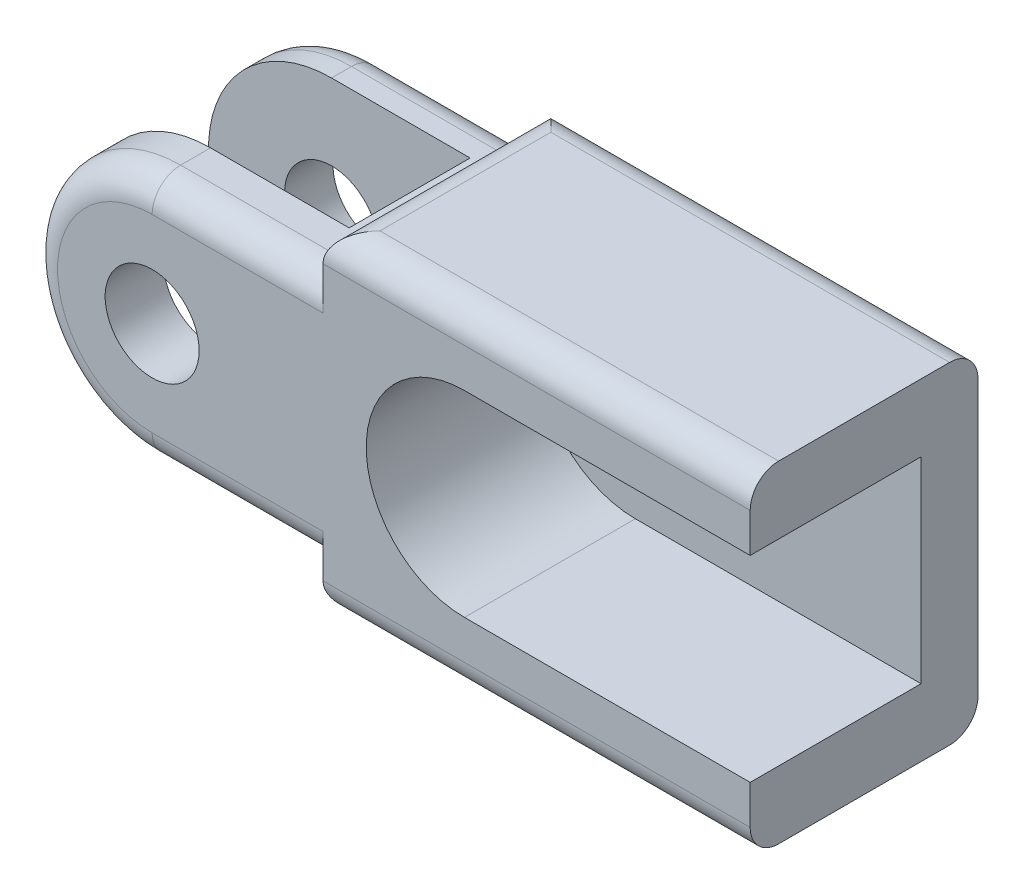
ISO-10303-21;
HEADER;
FILE_DESCRIPTION(('STEP AP214'),'2;1');
FILE_NAME('part.step','',(''),(''),'','','');
FILE_SCHEMA(('AUTOMOTIVE_DESIGN { 1 0 10303 214 1 1 1 1 }'));
ENDSEC;
DATA;
#1=APPLICATION_CONTEXT('core data for automotive mechanical design processes');
#2=APPLICATION_PROTOCOL_DEFINITION('international standard','automotive_design',2000,#1);
#3=PRODUCT_CONTEXT('',#1,'mechanical');
#4=PRODUCT('Part','Part','',(#3));
#5=PRODUCT_RELATED_PRODUCT_CATEGORY('part','',(#4));
#6=PRODUCT_DEFINITION_FORMATION('','',#4);
#7=PRODUCT_DEFINITION_CONTEXT('part definition',#1,'design');
#8=PRODUCT_DEFINITION('design','',#6,#7);
#9=PRODUCT_DEFINITION_SHAPE('','',#8);
#10=(LENGTH_UNIT() NAMED_UNIT(*) SI_UNIT(.MILLI.,.METRE.));
#11=(NAMED_UNIT(*) PLANE_ANGLE_UNIT() SI_UNIT($,.RADIAN.));
#12=(NAMED_UNIT(*) SI_UNIT($,.STERADIAN.) SOLID_ANGLE_UNIT());
#13=UNCERTAINTY_MEASURE_WITH_UNIT(LENGTH_MEASURE(1.E-05),#10,'distance_accuracy_value','');
#14=(GEOMETRIC_REPRESENTATION_CONTEXT(3) GLOBAL_UNCERTAINTY_ASSIGNED_CONTEXT((#13)) GLOBAL_UNIT_ASSIGNED_CONTEXT((#10,
#11,#12)) REPRESENTATION_CONTEXT('',''));
#15=CARTESIAN_POINT('',(0.,0.,0.));
#16=DIRECTION('',(0.,0.,1.));
#17=DIRECTION('',(1.,0.,0.));
#18=AXIS2_PLACEMENT_3D('',#15,#16,#17);
#19=CARTESIAN_POINT('',(-1.,0.,10.));
#20=DIRECTION('',(0.,0.,-1.));
#21=DIRECTION('',(-1.,0.,0.));
#22=AXIS2_PLACEMENT_3D('',#19,#20,#21);
#23=CYLINDRICAL_SURFACE('',#22,4.32034779176756);
#24=DIRECTION('',(0.,0.,-1.));
#25=VECTOR('',#24,1.);
#26=CARTESIAN_POINT('',(-1.,4.32034779176756,10.));
#27=LINE('',#26,#25);
#28=CARTESIAN_POINT('',(-1.,4.32034779176756,3.7));
#29=VERTEX_POINT('',#28);
#30=CARTESIAN_POINT('',(-1.,4.32034779176756,3.));
#31=VERTEX_POINT('',#30);
#32=EDGE_CURVE('E329',#29,#31,#27,.T.);
#33=ORIENTED_EDGE('',*,*,#32,.T.);
#34=CARTESIAN_POINT('',(-1.,0.,3.));
#35=DIRECTION('',(0.,0.,1.));
#36=DIRECTION('',(1.,0.,0.));
#37=AXIS2_PLACEMENT_3D('',#34,#35,#36);
#38=CIRCLE('',#37,4.32034779176756);
#39=CARTESIAN_POINT('',(-1.,-4.32034779176756,3.));
#40=VERTEX_POINT('',#39);
#41=EDGE_CURVE('E452',#31,#40,#38,.T.);
#42=ORIENTED_EDGE('',*,*,#41,.T.);
#43=DIRECTION('',(0.,0.,-1.));
#44=VECTOR('',#43,1.);
#45=CARTESIAN_POINT('',(-1.,-4.32034779176756,10.));
#46=LINE('',#45,#44);
#47=CARTESIAN_POINT('',(-1.,-4.32034779176756,3.7));
#48=VERTEX_POINT('',#47);
#49=EDGE_CURVE('E326',#48,#40,#46,.T.);
#50=ORIENTED_EDGE('',*,*,#49,.F.);
#51=CARTESIAN_POINT('',(-1.,0.,3.7));
#52=DIRECTION('',(0.,0.,-1.));
#53=DIRECTION('',(-1.,0.,0.));
#54=AXIS2_PLACEMENT_3D('',#51,#52,#53);
#55=CIRCLE('',#54,4.32034779176756);
#56=EDGE_CURVE('E295',#48,#29,#55,.T.);
#57=ORIENTED_EDGE('',*,*,#56,.T.);
#58=EDGE_LOOP('',(#33,#42,#50,#57));
#59=FACE_BOUND('',#58,.T.);
#60=ADVANCED_FACE('F58',(#59),#23,.T.);
#61=CARTESIAN_POINT('',(0.,-4.32034779176756,10.));
#62=DIRECTION('',(0.,-1.,0.));
#63=DIRECTION('',(0.,0.,-1.));
#64=AXIS2_PLACEMENT_3D('',#61,#62,#63);
#65=PLANE('',#64);
#66=ORIENTED_EDGE('',*,*,#49,.T.);
#67=DIRECTION('',(-1.,0.,0.));
#68=VECTOR('',#67,1.);
#69=CARTESIAN_POINT('',(0.,-4.32034779176756,3.));
#70=LINE('',#69,#68);
#71=CARTESIAN_POINT('',(0.,-4.32034779176756,3.));
#72=VERTEX_POINT('',#71);
#73=EDGE_CURVE('E405',#40,#72,#70,.F.);
#74=ORIENTED_EDGE('',*,*,#73,.T.);
#75=DIRECTION('',(0.,0.,-1.));
#76=VECTOR('',#75,1.);
#77=CARTESIAN_POINT('',(0.,-4.32034779176756,10.));
#78=LINE('',#77,#76);
#79=CARTESIAN_POINT('',(0.,-4.32034779176756,3.7));
#80=VERTEX_POINT('',#79);
#81=EDGE_CURVE('E323',#80,#72,#78,.T.);
#82=ORIENTED_EDGE('',*,*,#81,.F.);
#83=DIRECTION('',(1.,0.,0.));
#84=VECTOR('',#83,1.);
#85=CARTESIAN_POINT('',(0.,-4.32034779176756,3.7));
#86=LINE('',#85,#84);
#87=EDGE_CURVE('E293',#48,#80,#86,.T.);
#88=ORIENTED_EDGE('',*,*,#87,.F.);
#89=EDGE_LOOP('',(#66,#74,#82,#88));
#90=FACE_BOUND('',#89,.T.);
#91=ADVANCED_FACE('F556',(#90),#65,.T.);
#92=CARTESIAN_POINT('',(0.,0.,10.));
#93=DIRECTION('',(1.,0.,0.));
#94=DIRECTION('',(0.,0.,-1.));
#95=AXIS2_PLACEMENT_3D('',#92,#93,#94);
#96=PLANE('',#95);
#97=ORIENTED_EDGE('',*,*,#81,.T.);
#98=CARTESIAN_POINT('',(0.,-3.32034779176756,3.));
#99=DIRECTION('',(1.,0.,0.));
#100=DIRECTION('',(0.,0.,-1.));
#101=AXIS2_PLACEMENT_3D('',#98,#99,#100);
#102=CIRCLE('',#101,1.);
#103=CARTESIAN_POINT('',(0.,-4.31965220823244,2.96270813448246));
#104=VERTEX_POINT('',#103);
#105=EDGE_CURVE('E407',#72,#104,#102,.T.);
#106=ORIENTED_EDGE('',*,*,#105,.T.);
#107=DIRECTION('',(0.,0.,-1.));
#108=VECTOR('',#107,1.);
#109=CARTESIAN_POINT('',(0.,-4.31965220823244,10.));
#110=LINE('',#109,#108);
#111=CARTESIAN_POINT('',(0.,-4.31965220823244,3.7));
#112=VERTEX_POINT('',#111);
#113=EDGE_CURVE('E306',#112,#104,#110,.T.);
#114=ORIENTED_EDGE('',*,*,#113,.F.);
#115=DIRECTION('',(0.,1.,0.));
#116=VECTOR('',#115,1.);
#117=CARTESIAN_POINT('',(0.,0.,3.7));
#118=LINE('',#117,#116);
#119=EDGE_CURVE('E291',#80,#112,#118,.T.);
#120=ORIENTED_EDGE('',*,*,#119,.F.);
#121=EDGE_LOOP('',(#97,#106,#114,#120));
#122=FACE_BOUND('',#121,.T.);
#123=ADVANCED_FACE('F563',(#122),#96,.T.);
#124=CARTESIAN_POINT('',(-1.,0.,2.));
#125=DIRECTION('',(0.,0.,1.));
#126=DIRECTION('',(1.,0.,0.));
#127=AXIS2_PLACEMENT_3D('',#124,#125,#126);
#128=CYLINDRICAL_SURFACE('',#127,1.65);
#129=CARTESIAN_POINT('',(-1.,0.,3.7));
#130=DIRECTION('',(0.,0.,-1.));
#131=DIRECTION('',(-1.,0.,0.));
#132=AXIS2_PLACEMENT_3D('',#129,#130,#131);
#133=CIRCLE('',#132,1.65);
#134=CARTESIAN_POINT('',(-2.65,0.,3.7));
#135=VERTEX_POINT('',#134);
#136=EDGE_CURVE('E290',#135,#135,#133,.F.);
#137=ORIENTED_EDGE('',*,*,#136,.T.);
#138=EDGE_LOOP('',(#137));
#139=FACE_BOUND('',#138,.T.);
#140=CARTESIAN_POINT('',(-1.,0.,2.));
#141=DIRECTION('',(0.,0.,1.));
#142=DIRECTION('',(1.,0.,0.));
#143=AXIS2_PLACEMENT_3D('',#140,#141,#142);
#144=CIRCLE('',#143,1.65);
#145=CARTESIAN_POINT('',(0.65,0.,2.));
#146=VERTEX_POINT('',#145);
#147=EDGE_CURVE('E303',#146,#146,#144,.T.);
#148=ORIENTED_EDGE('',*,*,#147,.F.);
#149=EDGE_LOOP('',(#148));
#150=FACE_BOUND('',#149,.T.);
#151=ADVANCED_FACE('F613',(#139,#150),#128,.F.);
#152=CARTESIAN_POINT('',(5.,0.,0.));
#153=DIRECTION('',(-1.,0.,0.));
#154=DIRECTION('',(0.,-1.,0.));
#155=AXIS2_PLACEMENT_3D('',#152,#153,#154);
#156=PLANE('',#155);
#157=DIRECTION('',(0.,-1.,0.));
#158=VECTOR('',#157,1.);
#159=CARTESIAN_POINT('',(5.,0.,2.));
#160=LINE('',#159,#158);
#161=CARTESIAN_POINT('',(5.,-3.32034779176756,2.));
#162=VERTEX_POINT('',#161);
#163=CARTESIAN_POINT('',(5.,-4.82034779176756,2.));
#164=VERTEX_POINT('',#163);
#165=EDGE_CURVE('E335',#162,#164,#160,.T.);
#166=ORIENTED_EDGE('',*,*,#165,.T.);
#167=DIRECTION('',(0.,0.,1.));
#168=VECTOR('',#167,1.);
#169=CARTESIAN_POINT('',(5.,-4.82034779176756,0.));
#170=LINE('',#169,#168);
#171=CARTESIAN_POINT('',(5.,-4.82034779176756,10.));
#172=VERTEX_POINT('',#171);
#173=EDGE_CURVE('E428',#164,#172,#170,.T.);
#174=ORIENTED_EDGE('',*,*,#173,.T.);
#175=DIRECTION('',(0.,1.,0.));
#176=VECTOR('',#175,1.);
#177=CARTESIAN_POINT('',(5.,0.,10.));
#178=LINE('',#177,#176);
#179=CARTESIAN_POINT('',(5.,-3.32034779176756,10.));
#180=VERTEX_POINT('',#179);
#181=EDGE_CURVE('E333',#172,#180,#178,.T.);
#182=ORIENTED_EDGE('',*,*,#181,.T.);
#183=CARTESIAN_POINT('',(5.,-3.32034779176756,9.));
#184=DIRECTION('',(-1.,0.,0.));
#185=DIRECTION('',(0.,-1.,0.));
#186=AXIS2_PLACEMENT_3D('',#183,#184,#185);
#187=CIRCLE('',#186,1.);
#188=CARTESIAN_POINT('',(5.,-4.31965220823244,9.03729186551754));
#189=VERTEX_POINT('',#188);
#190=EDGE_CURVE('E12',#180,#189,#187,.F.);
#191=ORIENTED_EDGE('',*,*,#190,.T.);
#192=DIRECTION('',(0.,0.,-1.));
#193=VECTOR('',#192,1.);
#194=CARTESIAN_POINT('',(5.,-4.31965220823244,10.));
#195=LINE('',#194,#193);
#196=CARTESIAN_POINT('',(5.,-4.31965220823244,2.96270813448246));
#197=VERTEX_POINT('',#196);
#198=EDGE_CURVE('E309',#189,#197,#195,.T.);
#199=ORIENTED_EDGE('',*,*,#198,.T.);
#200=CARTESIAN_POINT('',(5.,-3.32034779176756,3.));
#201=DIRECTION('',(-1.,0.,0.));
#202=DIRECTION('',(0.,-1.,0.));
#203=AXIS2_PLACEMENT_3D('',#200,#201,#202);
#204=CIRCLE('',#203,1.);
#205=EDGE_CURVE('E458',#197,#162,#204,.F.);
#206=ORIENTED_EDGE('',*,*,#205,.T.);
#207=EDGE_LOOP('',(#166,#174,#182,#191,#199,#206));
#208=FACE_BOUND('',#207,.T.);
#209=ADVANCED_FACE('F499',(#208),#156,.T.);
#210=CARTESIAN_POINT('',(5.,3.32034779176756,10.));
#211=VERTEX_POINT('',#210);
#212=CARTESIAN_POINT('',(5.,4.82034779176756,10.));
#213=VERTEX_POINT('',#212);
#214=EDGE_CURVE('E332',#211,#213,#178,.T.);
#215=ORIENTED_EDGE('',*,*,#214,.T.);
#216=DIRECTION('',(0.,0.,1.));
#217=VECTOR('',#216,1.);
#218=CARTESIAN_POINT('',(5.,4.82034779176756,0.));
#219=LINE('',#218,#217);
#220=CARTESIAN_POINT('',(5.,4.82034779176756,2.));
#221=VERTEX_POINT('',#220);
#222=EDGE_CURVE('E442',#213,#221,#219,.F.);
#223=ORIENTED_EDGE('',*,*,#222,.T.);
#224=CARTESIAN_POINT('',(5.,3.32034779176756,2.));
#225=VERTEX_POINT('',#224);
#226=EDGE_CURVE('E336',#221,#225,#160,.T.);
#227=ORIENTED_EDGE('',*,*,#226,.T.);
#228=CARTESIAN_POINT('',(5.,3.32034779176756,3.));
#229=DIRECTION('',(-1.,0.,0.));
#230=DIRECTION('',(0.,-1.,0.));
#231=AXIS2_PLACEMENT_3D('',#228,#229,#230);
#232=CIRCLE('',#231,1.);
#233=CARTESIAN_POINT('',(5.,4.32034779176756,3.));
#234=VERTEX_POINT('',#233);
#235=EDGE_CURVE('E456',#225,#234,#232,.F.);
#236=ORIENTED_EDGE('',*,*,#235,.T.);
#237=DIRECTION('',(0.,0.,1.));
#238=VECTOR('',#237,1.);
#239=CARTESIAN_POINT('',(5.,4.32034779176756,10.));
#240=LINE('',#239,#238);
#241=CARTESIAN_POINT('',(5.,4.32034779176756,9.));
#242=VERTEX_POINT('',#241);
#243=EDGE_CURVE('E312',#234,#242,#240,.T.);
#244=ORIENTED_EDGE('',*,*,#243,.T.);
#245=CARTESIAN_POINT('',(5.,3.32034779176756,9.));
#246=DIRECTION('',(-1.,0.,0.));
#247=DIRECTION('',(0.,-1.,0.));
#248=AXIS2_PLACEMENT_3D('',#245,#246,#247);
#249=CIRCLE('',#248,1.);
#250=EDGE_CURVE('E67',#242,#211,#249,.F.);
#251=ORIENTED_EDGE('',*,*,#250,.T.);
#252=EDGE_LOOP('',(#215,#223,#227,#236,#244,#251));
#253=FACE_BOUND('',#252,.T.);
#254=ADVANCED_FACE('F522',(#253),#156,.T.);
#255=CARTESIAN_POINT('',(0.,0.,10.));
#256=DIRECTION('',(0.,0.,1.));
#257=DIRECTION('',(1.,0.,0.));
#258=AXIS2_PLACEMENT_3D('',#255,#256,#257);
#259=PLANE('',#258);
#260=CARTESIAN_POINT('',(-1.,0.,10.));
#261=DIRECTION('',(0.,0.,1.));
#262=DIRECTION('',(1.,0.,0.));
#263=AXIS2_PLACEMENT_3D('',#260,#261,#262);
#264=CIRCLE('',#263,1.65);
#265=CARTESIAN_POINT('',(0.65,0.,10.));
#266=VERTEX_POINT('',#265);
#267=EDGE_CURVE('E302',#266,#266,#264,.T.);
#268=ORIENTED_EDGE('',*,*,#267,.F.);
#269=EDGE_LOOP('',(#268));
#270=FACE_BOUND('',#269,.T.);
#271=DIRECTION('',(0.,1.,0.));
#272=VECTOR('',#271,1.);
#273=CARTESIAN_POINT('',(20.,6.,10.));
#274=LINE('',#273,#272);
#275=CARTESIAN_POINT('',(20.,3.45,10.));
#276=VERTEX_POINT('',#275);
#277=CARTESIAN_POINT('',(20.,4.82034779176756,10.));
#278=VERTEX_POINT('',#277);
#279=EDGE_CURVE('E375',#276,#278,#274,.T.);
#280=ORIENTED_EDGE('',*,*,#279,.T.);
#281=DIRECTION('',(-1.,0.,0.));
#282=VECTOR('',#281,1.);
#283=CARTESIAN_POINT('',(0.,4.82034779176756,10.));
#284=LINE('',#283,#282);
#285=EDGE_CURVE('E422',#278,#213,#284,.T.);
#286=ORIENTED_EDGE('',*,*,#285,.T.);
#287=ORIENTED_EDGE('',*,*,#214,.F.);
#288=DIRECTION('',(1.,0.,0.));
#289=VECTOR('',#288,1.);
#290=CARTESIAN_POINT('',(0.,3.32034779176756,10.));
#291=LINE('',#290,#289);
#292=CARTESIAN_POINT('',(-1.,3.32034779176756,10.));
#293=VERTEX_POINT('',#292);
#294=EDGE_CURVE('E418',#211,#293,#291,.F.);
#295=ORIENTED_EDGE('',*,*,#294,.T.);
#296=CARTESIAN_POINT('',(-1.,0.,10.));
#297=DIRECTION('',(0.,0.,1.));
#298=DIRECTION('',(1.,0.,0.));
#299=AXIS2_PLACEMENT_3D('',#296,#297,#298);
#300=CIRCLE('',#299,3.32034779176756);
#301=CARTESIAN_POINT('',(-1.,-3.32034779176756,10.));
#302=VERTEX_POINT('',#301);
#303=EDGE_CURVE('E413',#293,#302,#300,.T.);
#304=ORIENTED_EDGE('',*,*,#303,.T.);
#305=DIRECTION('',(-1.,0.,0.));
#306=VECTOR('',#305,1.);
#307=CARTESIAN_POINT('',(0.,-3.32034779176756,10.));
#308=LINE('',#307,#306);
#309=EDGE_CURVE('E415',#302,#180,#308,.F.);
#310=ORIENTED_EDGE('',*,*,#309,.T.);
#311=ORIENTED_EDGE('',*,*,#181,.F.);
#312=DIRECTION('',(1.,0.,0.));
#313=VECTOR('',#312,1.);
#314=CARTESIAN_POINT('',(0.,-4.82034779176756,10.));
#315=LINE('',#314,#313);
#316=CARTESIAN_POINT('',(20.,-4.82034779176756,10.));
#317=VERTEX_POINT('',#316);
#318=EDGE_CURVE('E420',#172,#317,#315,.T.);
#319=ORIENTED_EDGE('',*,*,#318,.T.);
#320=CARTESIAN_POINT('',(20.,-3.45,10.));
#321=VERTEX_POINT('',#320);
#322=EDGE_CURVE('E376',#317,#321,#274,.T.);
#323=ORIENTED_EDGE('',*,*,#322,.T.);
#324=DIRECTION('',(1.,0.,0.));
#325=VECTOR('',#324,1.);
#326=CARTESIAN_POINT('',(9.96761183830891,-3.45,10.));
#327=LINE('',#326,#325);
#328=CARTESIAN_POINT('',(9.96761183830891,-3.45,10.));
#329=VERTEX_POINT('',#328);
#330=EDGE_CURVE('E355',#329,#321,#327,.T.);
#331=ORIENTED_EDGE('',*,*,#330,.F.);
#332=CARTESIAN_POINT('',(9.96761183830891,0.,10.));
#333=DIRECTION('',(0.,0.,1.));
#334=DIRECTION('',(1.,0.,0.));
#335=AXIS2_PLACEMENT_3D('',#332,#333,#334);
#336=CIRCLE('',#335,3.45);
#337=CARTESIAN_POINT('',(9.96761183830891,3.45,10.));
#338=VERTEX_POINT('',#337);
#339=EDGE_CURVE('E349',#338,#329,#336,.T.);
#340=ORIENTED_EDGE('',*,*,#339,.F.);
#341=DIRECTION('',(-1.,0.,0.));
#342=VECTOR('',#341,1.);
#343=CARTESIAN_POINT('',(0.,3.45,10.));
#344=LINE('',#343,#342);
#345=EDGE_CURVE('E378',#276,#338,#344,.T.);
#346=ORIENTED_EDGE('',*,*,#345,.F.);
#347=EDGE_LOOP('',(#280,#286,#287,#295,#304,#310,#311,#319,#323,#331,#340,#346));
#348=FACE_BOUND('',#347,.T.);
#349=ADVANCED_FACE('F531',(#270,#348),#259,.T.);
#350=CARTESIAN_POINT('',(0.,0.,2.));
#351=DIRECTION('',(0.,0.,1.));
#352=DIRECTION('',(1.,0.,0.));
#353=AXIS2_PLACEMENT_3D('',#350,#351,#352);
#354=PLANE('',#353);
#355=ORIENTED_EDGE('',*,*,#147,.T.);
#356=EDGE_LOOP('',(#355));
#357=FACE_BOUND('',#356,.T.);
#358=CARTESIAN_POINT('',(13.9676118383089,0.,2.));
#359=DIRECTION('',(0.,0.,1.));
#360=DIRECTION('',(1.,0.,0.));
#361=AXIS2_PLACEMENT_3D('',#358,#359,#360);
#362=CIRCLE('',#361,1.35);
#363=CARTESIAN_POINT('',(15.3176118383089,0.,2.));
#364=VERTEX_POINT('',#363);
#365=EDGE_CURVE('E341',#364,#364,#362,.F.);
#366=ORIENTED_EDGE('',*,*,#365,.F.);
#367=EDGE_LOOP('',(#366));
#368=FACE_BOUND('',#367,.T.);
#369=CARTESIAN_POINT('',(9.96761183830889,0.,2.));
#370=DIRECTION('',(0.,0.,1.));
#371=DIRECTION('',(1.,0.,0.));
#372=AXIS2_PLACEMENT_3D('',#369,#370,#371);
#373=CIRCLE('',#372,1.35);
#374=CARTESIAN_POINT('',(11.3176118383089,0.,2.));
#375=VERTEX_POINT('',#374);
#376=EDGE_CURVE('E342',#375,#375,#373,.F.);
#377=ORIENTED_EDGE('',*,*,#376,.F.);
#378=EDGE_LOOP('',(#377));
#379=FACE_BOUND('',#378,.T.);
#380=ORIENTED_EDGE('',*,*,#226,.F.);
#381=DIRECTION('',(-1.,0.,0.));
#382=VECTOR('',#381,1.);
#383=CARTESIAN_POINT('',(20.,4.82034779176756,2.));
#384=LINE('',#383,#382);
#385=CARTESIAN_POINT('',(20.,4.82034779176756,2.));
#386=VERTEX_POINT('',#385);
#387=EDGE_CURVE('E398',#221,#386,#384,.F.);
#388=ORIENTED_EDGE('',*,*,#387,.T.);
#389=DIRECTION('',(0.,-1.,0.));
#390=VECTOR('',#389,1.);
#391=CARTESIAN_POINT('',(20.,6.,2.));
#392=LINE('',#391,#390);
#393=CARTESIAN_POINT('',(20.,-4.82034779176756,2.));
#394=VERTEX_POINT('',#393);
#395=EDGE_CURVE('E338',#386,#394,#392,.T.);
#396=ORIENTED_EDGE('',*,*,#395,.T.);
#397=DIRECTION('',(1.,0.,0.));
#398=VECTOR('',#397,1.);
#399=CARTESIAN_POINT('',(5.,-4.82034779176756,2.));
#400=LINE('',#399,#398);
#401=EDGE_CURVE('E396',#394,#164,#400,.F.);
#402=ORIENTED_EDGE('',*,*,#401,.T.);
#403=ORIENTED_EDGE('',*,*,#165,.F.);
#404=DIRECTION('',(-1.,0.,0.));
#405=VECTOR('',#404,1.);
#406=CARTESIAN_POINT('',(-1.,-3.32034779176756,2.));
#407=LINE('',#406,#405);
#408=CARTESIAN_POINT('',(-1.,-3.32034779176756,2.));
#409=VERTEX_POINT('',#408);
#410=EDGE_CURVE('E391',#162,#409,#407,.T.);
#411=ORIENTED_EDGE('',*,*,#410,.T.);
#412=CARTESIAN_POINT('',(-1.,0.,2.));
#413=DIRECTION('',(0.,0.,1.));
#414=DIRECTION('',(1.,0.,0.));
#415=AXIS2_PLACEMENT_3D('',#412,#413,#414);
#416=CIRCLE('',#415,3.32034779176756);
#417=CARTESIAN_POINT('',(-1.,3.32034779176756,2.));
#418=VERTEX_POINT('',#417);
#419=EDGE_CURVE('E383',#409,#418,#416,.F.);
#420=ORIENTED_EDGE('',*,*,#419,.T.);
#421=DIRECTION('',(1.,0.,0.));
#422=VECTOR('',#421,1.);
#423=CARTESIAN_POINT('',(5.,3.32034779176756,2.));
#424=LINE('',#423,#422);
#425=EDGE_CURVE('E393',#418,#225,#424,.T.);
#426=ORIENTED_EDGE('',*,*,#425,.T.);
#427=EDGE_LOOP('',(#380,#388,#396,#402,#403,#411,#420,#426));
#428=FACE_BOUND('',#427,.T.);
#429=ADVANCED_FACE('F486',(#357,#368,#379,#428),#354,.F.);
#430=CARTESIAN_POINT('',(20.,6.,10.));
#431=DIRECTION('',(-1.,0.,0.));
#432=DIRECTION('',(0.,-1.,0.));
#433=AXIS2_PLACEMENT_3D('',#430,#431,#432);
#434=PLANE('',#433);
#435=ORIENTED_EDGE('',*,*,#395,.F.);
#436=CARTESIAN_POINT('',(20.,4.82034779176756,3.));
#437=DIRECTION('',(-1.,0.,0.));
#438=DIRECTION('',(0.,-1.,0.));
#439=AXIS2_PLACEMENT_3D('',#436,#437,#438);
#440=CIRCLE('',#439,1.);
#441=CARTESIAN_POINT('',(20.,5.82034779176756,3.));
#442=VERTEX_POINT('',#441);
#443=EDGE_CURVE('E450',#386,#442,#440,.F.);
#444=ORIENTED_EDGE('',*,*,#443,.T.);
#445=DIRECTION('',(0.,0.,1.));
#446=VECTOR('',#445,1.);
#447=CARTESIAN_POINT('',(20.,5.82034779176756,2.));
#448=LINE('',#447,#446);
#449=CARTESIAN_POINT('',(20.,5.82034779176756,9.));
#450=VERTEX_POINT('',#449);
#451=EDGE_CURVE('E320',#442,#450,#448,.T.);
#452=ORIENTED_EDGE('',*,*,#451,.T.);
#453=CARTESIAN_POINT('',(20.,4.82034779176756,9.));
#454=DIRECTION('',(-1.,0.,0.));
#455=DIRECTION('',(0.,-1.,0.));
#456=AXIS2_PLACEMENT_3D('',#453,#454,#455);
#457=CIRCLE('',#456,1.);
#458=EDGE_CURVE('E448',#450,#278,#457,.F.);
#459=ORIENTED_EDGE('',*,*,#458,.T.);
#460=ORIENTED_EDGE('',*,*,#279,.F.);
#461=DIRECTION('',(0.,0.,-1.));
#462=VECTOR('',#461,1.);
#463=CARTESIAN_POINT('',(20.,3.45,10.));
#464=LINE('',#463,#462);
#465=CARTESIAN_POINT('',(20.,3.45,4.));
#466=VERTEX_POINT('',#465);
#467=EDGE_CURVE('E369',#276,#466,#464,.T.);
#468=ORIENTED_EDGE('',*,*,#467,.T.);
#469=DIRECTION('',(0.,1.,0.));
#470=VECTOR('',#469,1.);
#471=CARTESIAN_POINT('',(20.,6.,4.));
#472=LINE('',#471,#470);
#473=CARTESIAN_POINT('',(20.,-3.45,4.));
#474=VERTEX_POINT('',#473);
#475=EDGE_CURVE('E381',#474,#466,#472,.T.);
#476=ORIENTED_EDGE('',*,*,#475,.F.);
#477=DIRECTION('',(0.,0.,1.));
#478=VECTOR('',#477,1.);
#479=CARTESIAN_POINT('',(20.,-3.45,4.));
#480=LINE('',#479,#478);
#481=EDGE_CURVE('E366',#474,#321,#480,.T.);
#482=ORIENTED_EDGE('',*,*,#481,.T.);
#483=ORIENTED_EDGE('',*,*,#322,.F.);
#484=CARTESIAN_POINT('',(20.,-4.82034779176756,9.));
#485=DIRECTION('',(-1.,0.,0.));
#486=DIRECTION('',(0.,-1.,0.));
#487=AXIS2_PLACEMENT_3D('',#484,#485,#486);
#488=CIRCLE('',#487,1.);
#489=CARTESIAN_POINT('',(20.,-5.82034779176756,9.));
#490=VERTEX_POINT('',#489);
#491=EDGE_CURVE('E446',#317,#490,#488,.F.);
#492=ORIENTED_EDGE('',*,*,#491,.T.);
#493=DIRECTION('',(0.,0.,1.));
#494=VECTOR('',#493,1.);
#495=CARTESIAN_POINT('',(20.,-5.82034779176756,2.));
#496=LINE('',#495,#494);
#497=CARTESIAN_POINT('',(20.,-5.82034779176756,3.));
#498=VERTEX_POINT('',#497);
#499=EDGE_CURVE('E316',#498,#490,#496,.T.);
#500=ORIENTED_EDGE('',*,*,#499,.F.);
#501=CARTESIAN_POINT('',(20.,-4.82034779176756,3.));
#502=DIRECTION('',(-1.,0.,0.));
#503=DIRECTION('',(0.,-1.,0.));
#504=AXIS2_PLACEMENT_3D('',#501,#502,#503);
#505=CIRCLE('',#504,1.);
#506=EDGE_CURVE('E444',#498,#394,#505,.F.);
#507=ORIENTED_EDGE('',*,*,#506,.T.);
#508=EDGE_LOOP('',(#435,#444,#452,#459,#460,#468,#476,#482,#483,#492,#500,#507));
#509=FACE_BOUND('',#508,.T.);
#510=ADVANCED_FACE('F489',(#509),#434,.F.);
#511=CARTESIAN_POINT('',(9.96761183830891,0.,4.));
#512=DIRECTION('',(0.,0.,1.));
#513=DIRECTION('',(1.,0.,0.));
#514=AXIS2_PLACEMENT_3D('',#511,#512,#513);
#515=PLANE('',#514);
#516=CARTESIAN_POINT('',(13.9676118383089,0.,4.));
#517=DIRECTION('',(0.,0.,1.));
#518=DIRECTION('',(1.,0.,0.));
#519=AXIS2_PLACEMENT_3D('',#516,#517,#518);
#520=CIRCLE('',#519,1.35);
#521=CARTESIAN_POINT('',(15.3176118383089,0.,4.));
#522=VERTEX_POINT('',#521);
#523=EDGE_CURVE('E346',#522,#522,#520,.T.);
#524=ORIENTED_EDGE('',*,*,#523,.F.);
#525=EDGE_LOOP('',(#524));
#526=FACE_BOUND('',#525,.T.);
#527=CARTESIAN_POINT('',(9.96761183830889,0.,4.));
#528=DIRECTION('',(0.,0.,1.));
#529=DIRECTION('',(1.,0.,0.));
#530=AXIS2_PLACEMENT_3D('',#527,#528,#529);
#531=CIRCLE('',#530,1.35);
#532=CARTESIAN_POINT('',(11.3176118383089,0.,4.));
#533=VERTEX_POINT('',#532);
#534=EDGE_CURVE('E345',#533,#533,#531,.T.);
#535=ORIENTED_EDGE('',*,*,#534,.F.);
#536=EDGE_LOOP('',(#535));
#537=FACE_BOUND('',#536,.T.);
#538=ORIENTED_EDGE('',*,*,#475,.T.);
#539=DIRECTION('',(-1.,0.,0.));
#540=VECTOR('',#539,1.);
#541=CARTESIAN_POINT('',(9.96761183830891,3.45,4.));
#542=LINE('',#541,#540);
#543=CARTESIAN_POINT('',(9.96761183830891,3.45,4.));
#544=VERTEX_POINT('',#543);
#545=EDGE_CURVE('E352',#466,#544,#542,.T.);
#546=ORIENTED_EDGE('',*,*,#545,.T.);
#547=CARTESIAN_POINT('',(9.96761183830891,0.,4.));
#548=DIRECTION('',(0.,0.,1.));
#549=DIRECTION('',(1.,0.,0.));
#550=AXIS2_PLACEMENT_3D('',#547,#548,#549);
#551=CIRCLE('',#550,3.45);
#552=CARTESIAN_POINT('',(9.96761183830891,-3.45,4.));
#553=VERTEX_POINT('',#552);
#554=EDGE_CURVE('E354',#544,#553,#551,.T.);
#555=ORIENTED_EDGE('',*,*,#554,.T.);
#556=DIRECTION('',(1.,0.,0.));
#557=VECTOR('',#556,1.);
#558=CARTESIAN_POINT('',(9.96761183830891,-3.45,4.));
#559=LINE('',#558,#557);
#560=EDGE_CURVE('E358',#553,#474,#559,.T.);
#561=ORIENTED_EDGE('',*,*,#560,.T.);
#562=EDGE_LOOP('',(#538,#546,#555,#561));
#563=FACE_BOUND('',#562,.T.);
#564=ADVANCED_FACE('F648',(#526,#537,#563),#515,.T.);
#565=CARTESIAN_POINT('',(9.96761183830891,3.45,4.));
#566=DIRECTION('',(0.,1.,0.));
#567=DIRECTION('',(0.,0.,1.));
#568=AXIS2_PLACEMENT_3D('',#565,#566,#567);
#569=PLANE('',#568);
#570=ORIENTED_EDGE('',*,*,#345,.T.);
#571=DIRECTION('',(0.,0.,1.));
#572=VECTOR('',#571,1.);
#573=CARTESIAN_POINT('',(9.96761183830891,3.45,4.));
#574=LINE('',#573,#572);
#575=EDGE_CURVE('E361',#544,#338,#574,.T.);
#576=ORIENTED_EDGE('',*,*,#575,.F.);
#577=ORIENTED_EDGE('',*,*,#545,.F.);
#578=ORIENTED_EDGE('',*,*,#467,.F.);
#579=EDGE_LOOP('',(#570,#576,#577,#578));
#580=FACE_BOUND('',#579,.T.);
#581=ADVANCED_FACE('F644',(#580),#569,.F.);
#582=CARTESIAN_POINT('',(9.96761183830891,-3.45,4.));
#583=DIRECTION('',(0.,-1.,0.));
#584=DIRECTION('',(1.,0.,0.));
#585=AXIS2_PLACEMENT_3D('',#582,#583,#584);
#586=PLANE('',#585);
#587=ORIENTED_EDGE('',*,*,#330,.T.);
#588=ORIENTED_EDGE('',*,*,#481,.F.);
#589=ORIENTED_EDGE('',*,*,#560,.F.);
#590=DIRECTION('',(0.,0.,1.));
#591=VECTOR('',#590,1.);
#592=CARTESIAN_POINT('',(9.96761183830891,-3.45,4.));
#593=LINE('',#592,#591);
#594=EDGE_CURVE('E370',#553,#329,#593,.T.);
#595=ORIENTED_EDGE('',*,*,#594,.T.);
#596=EDGE_LOOP('',(#587,#588,#589,#595));
#597=FACE_BOUND('',#596,.T.);
#598=ADVANCED_FACE('F781',(#597),#586,.F.);
#599=CARTESIAN_POINT('',(9.96761183830891,0.,4.));
#600=DIRECTION('',(0.,0.,1.));
#601=DIRECTION('',(1.,0.,0.));
#602=AXIS2_PLACEMENT_3D('',#599,#600,#601);
#603=CYLINDRICAL_SURFACE('',#602,3.45);
#604=ORIENTED_EDGE('',*,*,#339,.T.);
#605=ORIENTED_EDGE('',*,*,#594,.F.);
#606=ORIENTED_EDGE('',*,*,#554,.F.);
#607=ORIENTED_EDGE('',*,*,#575,.T.);
#608=EDGE_LOOP('',(#604,#605,#606,#607));
#609=FACE_BOUND('',#608,.T.);
#610=ADVANCED_FACE('F759',(#609),#603,.F.);
#611=CARTESIAN_POINT('',(9.96761183830889,0.,-23.));
#612=DIRECTION('',(0.,0.,1.));
#613=DIRECTION('',(1.,0.,0.));
#614=AXIS2_PLACEMENT_3D('',#611,#612,#613);
#615=CYLINDRICAL_SURFACE('',#614,1.35);
#616=ORIENTED_EDGE('',*,*,#376,.T.);
#617=EDGE_LOOP('',(#616));
#618=FACE_BOUND('',#617,.T.);
#619=ORIENTED_EDGE('',*,*,#534,.T.);
#620=EDGE_LOOP('',(#619));
#621=FACE_BOUND('',#620,.T.);
#622=ADVANCED_FACE('F551',(#618,#621),#615,.F.);
#623=CARTESIAN_POINT('',(13.9676118383089,0.,-23.));
#624=DIRECTION('',(0.,0.,1.));
#625=DIRECTION('',(1.,0.,0.));
#626=AXIS2_PLACEMENT_3D('',#623,#624,#625);
#627=CYLINDRICAL_SURFACE('',#626,1.35);
#628=ORIENTED_EDGE('',*,*,#365,.T.);
#629=EDGE_LOOP('',(#628));
#630=FACE_BOUND('',#629,.T.);
#631=ORIENTED_EDGE('',*,*,#523,.T.);
#632=EDGE_LOOP('',(#631));
#633=FACE_BOUND('',#632,.T.);
#634=ADVANCED_FACE('F542',(#630,#633),#627,.F.);
#635=CARTESIAN_POINT('',(5.,5.82034779176756,2.));
#636=DIRECTION('',(0.,1.,0.));
#637=DIRECTION('',(0.,0.,1.));
#638=AXIS2_PLACEMENT_3D('',#635,#636,#637);
#639=PLANE('',#638);
#640=ORIENTED_EDGE('',*,*,#451,.F.);
#641=DIRECTION('',(-1.,0.,0.));
#642=VECTOR('',#641,1.);
#643=CARTESIAN_POINT('',(5.,5.82034779176756,3.));
#644=LINE('',#643,#642);
#645=CARTESIAN_POINT('',(6.,5.82034779176756,3.));
#646=VERTEX_POINT('',#645);
#647=EDGE_CURVE('E75',#442,#646,#644,.T.);
#648=ORIENTED_EDGE('',*,*,#647,.T.);
#649=DIRECTION('',(0.,0.,1.));
#650=VECTOR('',#649,1.);
#651=CARTESIAN_POINT('',(6.,5.82034779176756,2.));
#652=LINE('',#651,#650);
#653=CARTESIAN_POINT('',(6.,5.82034779176756,9.));
#654=VERTEX_POINT('',#653);
#655=EDGE_CURVE('E439',#646,#654,#652,.T.);
#656=ORIENTED_EDGE('',*,*,#655,.T.);
#657=DIRECTION('',(-1.,0.,0.));
#658=VECTOR('',#657,1.);
#659=CARTESIAN_POINT('',(5.,5.82034779176756,9.));
#660=LINE('',#659,#658);
#661=EDGE_CURVE('E437',#654,#450,#660,.F.);
#662=ORIENTED_EDGE('',*,*,#661,.T.);
#663=EDGE_LOOP('',(#640,#648,#656,#662));
#664=FACE_BOUND('',#663,.T.);
#665=ADVANCED_FACE('F539',(#664),#639,.T.);
#666=CARTESIAN_POINT('',(5.,-5.82034779176756,2.));
#667=DIRECTION('',(0.,-1.,0.));
#668=DIRECTION('',(0.,0.,-1.));
#669=AXIS2_PLACEMENT_3D('',#666,#667,#668);
#670=PLANE('',#669);
#671=ORIENTED_EDGE('',*,*,#499,.T.);
#672=DIRECTION('',(1.,0.,0.));
#673=VECTOR('',#672,1.);
#674=CARTESIAN_POINT('',(5.,-5.82034779176756,9.));
#675=LINE('',#674,#673);
#676=CARTESIAN_POINT('',(6.,-5.82034779176756,9.));
#677=VERTEX_POINT('',#676);
#678=EDGE_CURVE('E435',#490,#677,#675,.F.);
#679=ORIENTED_EDGE('',*,*,#678,.T.);
#680=DIRECTION('',(0.,0.,1.));
#681=VECTOR('',#680,1.);
#682=CARTESIAN_POINT('',(6.,-5.82034779176756,2.));
#683=LINE('',#682,#681);
#684=CARTESIAN_POINT('',(6.,-5.82034779176756,3.));
#685=VERTEX_POINT('',#684);
#686=EDGE_CURVE('E433',#677,#685,#683,.F.);
#687=ORIENTED_EDGE('',*,*,#686,.T.);
#688=DIRECTION('',(1.,0.,0.));
#689=VECTOR('',#688,1.);
#690=CARTESIAN_POINT('',(20.,-5.82034779176756,3.));
#691=LINE('',#690,#689);
#692=EDGE_CURVE('E431',#685,#498,#691,.T.);
#693=ORIENTED_EDGE('',*,*,#692,.T.);
#694=EDGE_LOOP('',(#671,#679,#687,#693));
#695=FACE_BOUND('',#694,.T.);
#696=ADVANCED_FACE('F541',(#695),#670,.T.);
#697=CARTESIAN_POINT('',(5.,-4.31965220823244,10.));
#698=DIRECTION('',(0.,1.,0.));
#699=DIRECTION('',(0.,0.,1.));
#700=AXIS2_PLACEMENT_3D('',#697,#698,#699);
#701=PLANE('',#700);
#702=ORIENTED_EDGE('',*,*,#113,.T.);
#703=DIRECTION('',(1.,0.,0.));
#704=VECTOR('',#703,1.);
#705=CARTESIAN_POINT('',(0.,-4.31965220823244,2.96270813448246));
#706=LINE('',#705,#704);
#707=EDGE_CURVE('E411',#104,#197,#706,.T.);
#708=ORIENTED_EDGE('',*,*,#707,.T.);
#709=ORIENTED_EDGE('',*,*,#198,.F.);
#710=DIRECTION('',(-1.,0.,0.));
#711=VECTOR('',#710,1.);
#712=CARTESIAN_POINT('',(5.,-4.31965220823244,9.03729186551754));
#713=LINE('',#712,#711);
#714=CARTESIAN_POINT('',(0.,-4.31965220823244,9.03729186551754));
#715=VERTEX_POINT('',#714);
#716=EDGE_CURVE('E409',#189,#715,#713,.T.);
#717=ORIENTED_EDGE('',*,*,#716,.T.);
#718=CARTESIAN_POINT('',(0.,-4.31965220823244,7.95));
#719=VERTEX_POINT('',#718);
#720=EDGE_CURVE('E313',#715,#719,#110,.T.);
#721=ORIENTED_EDGE('',*,*,#720,.T.);
#722=DIRECTION('',(1.,0.,0.));
#723=VECTOR('',#722,1.);
#724=CARTESIAN_POINT('',(5.,-4.31965220823244,7.95));
#725=LINE('',#724,#723);
#726=CARTESIAN_POINT('',(3.86612802752068,-4.31965220823244,7.95));
#727=VERTEX_POINT('',#726);
#728=EDGE_CURVE('E288',#719,#727,#725,.T.);
#729=ORIENTED_EDGE('',*,*,#728,.T.);
#730=DIRECTION('',(0.,0.,-1.));
#731=VECTOR('',#730,1.);
#732=CARTESIAN_POINT('',(3.86612802752068,-4.31965220823244,10.));
#733=LINE('',#732,#731);
#734=CARTESIAN_POINT('',(3.86612802752068,-4.31965220823244,3.7));
#735=VERTEX_POINT('',#734);
#736=EDGE_CURVE('E256',#727,#735,#733,.T.);
#737=ORIENTED_EDGE('',*,*,#736,.T.);
#738=DIRECTION('',(-1.,0.,0.));
#739=VECTOR('',#738,1.);
#740=CARTESIAN_POINT('',(5.,-4.31965220823244,3.7));
#741=LINE('',#740,#739);
#742=EDGE_CURVE('E298',#735,#112,#741,.T.);
#743=ORIENTED_EDGE('',*,*,#742,.T.);
#744=EDGE_LOOP('',(#702,#708,#709,#717,#721,#729,#737,#743));
#745=FACE_BOUND('',#744,.T.);
#746=ADVANCED_FACE('F548',(#745),#701,.F.);
#747=CARTESIAN_POINT('',(-1.,-4.32034779176756,9.));
#748=VERTEX_POINT('',#747);
#749=CARTESIAN_POINT('',(-1.,-4.32034779176756,7.95));
#750=VERTEX_POINT('',#749);
#751=EDGE_CURVE('E327',#748,#750,#46,.T.);
#752=ORIENTED_EDGE('',*,*,#751,.F.);
#753=CARTESIAN_POINT('',(-1.,0.,9.));
#754=DIRECTION('',(0.,0.,1.));
#755=DIRECTION('',(1.,0.,0.));
#756=AXIS2_PLACEMENT_3D('',#753,#754,#755);
#757=CIRCLE('',#756,4.32034779176756);
#758=CARTESIAN_POINT('',(-1.,4.32034779176756,9.));
#759=VERTEX_POINT('',#758);
#760=EDGE_CURVE('E454',#748,#759,#757,.F.);
#761=ORIENTED_EDGE('',*,*,#760,.T.);
#762=CARTESIAN_POINT('',(-1.,4.32034779176756,7.95));
#763=VERTEX_POINT('',#762);
#764=EDGE_CURVE('E330',#759,#763,#27,.T.);
#765=ORIENTED_EDGE('',*,*,#764,.T.);
#766=CARTESIAN_POINT('',(-1.,0.,7.95));
#767=DIRECTION('',(0.,0.,1.));
#768=DIRECTION('',(1.,0.,0.));
#769=AXIS2_PLACEMENT_3D('',#766,#767,#768);
#770=CIRCLE('',#769,4.32034779176756);
#771=EDGE_CURVE('E270',#763,#750,#770,.T.);
#772=ORIENTED_EDGE('',*,*,#771,.T.);
#773=EDGE_LOOP('',(#752,#761,#765,#772));
#774=FACE_BOUND('',#773,.T.);
#775=ADVANCED_FACE('F559',(#774),#23,.T.);
#776=CARTESIAN_POINT('',(0.,-4.32034779176756,9.));
#777=VERTEX_POINT('',#776);
#778=CARTESIAN_POINT('',(0.,-4.32034779176756,7.95));
#779=VERTEX_POINT('',#778);
#780=EDGE_CURVE('E324',#777,#779,#78,.T.);
#781=ORIENTED_EDGE('',*,*,#780,.F.);
#782=DIRECTION('',(-1.,0.,0.));
#783=VECTOR('',#782,1.);
#784=CARTESIAN_POINT('',(0.,-4.32034779176756,9.));
#785=LINE('',#784,#783);
#786=EDGE_CURVE('E424',#777,#748,#785,.T.);
#787=ORIENTED_EDGE('',*,*,#786,.T.);
#788=ORIENTED_EDGE('',*,*,#751,.T.);
#789=DIRECTION('',(-1.,0.,0.));
#790=VECTOR('',#789,1.);
#791=CARTESIAN_POINT('',(0.,-4.32034779176756,7.95));
#792=LINE('',#791,#790);
#793=EDGE_CURVE('E285',#779,#750,#792,.T.);
#794=ORIENTED_EDGE('',*,*,#793,.F.);
#795=EDGE_LOOP('',(#781,#787,#788,#794));
#796=FACE_BOUND('',#795,.T.);
#797=ADVANCED_FACE('F565',(#796),#65,.T.);
#798=ORIENTED_EDGE('',*,*,#720,.F.);
#799=CARTESIAN_POINT('',(0.,-3.32034779176756,9.));
#800=DIRECTION('',(1.,0.,0.));
#801=DIRECTION('',(0.,0.,-1.));
#802=AXIS2_PLACEMENT_3D('',#799,#800,#801);
#803=CIRCLE('',#802,1.);
#804=EDGE_CURVE('E426',#715,#777,#803,.T.);
#805=ORIENTED_EDGE('',*,*,#804,.T.);
#806=ORIENTED_EDGE('',*,*,#780,.T.);
#807=DIRECTION('',(0.,-1.,0.));
#808=VECTOR('',#807,1.);
#809=CARTESIAN_POINT('',(0.,0.,7.95));
#810=LINE('',#809,#808);
#811=EDGE_CURVE('E283',#719,#779,#810,.T.);
#812=ORIENTED_EDGE('',*,*,#811,.F.);
#813=EDGE_LOOP('',(#798,#805,#806,#812));
#814=FACE_BOUND('',#813,.T.);
#815=ADVANCED_FACE('F573',(#814),#96,.T.);
#816=CARTESIAN_POINT('',(0.,4.32034779176756,10.));
#817=DIRECTION('',(0.,1.,0.));
#818=DIRECTION('',(0.,0.,1.));
#819=AXIS2_PLACEMENT_3D('',#816,#817,#818);
#820=PLANE('',#819);
#821=ORIENTED_EDGE('',*,*,#243,.F.);
#822=DIRECTION('',(1.,0.,0.));
#823=VECTOR('',#822,1.);
#824=CARTESIAN_POINT('',(-1.,4.32034779176756,3.));
#825=LINE('',#824,#823);
#826=EDGE_CURVE('E403',#234,#31,#825,.F.);
#827=ORIENTED_EDGE('',*,*,#826,.T.);
#828=ORIENTED_EDGE('',*,*,#32,.F.);
#829=DIRECTION('',(-1.,0.,0.));
#830=VECTOR('',#829,1.);
#831=CARTESIAN_POINT('',(-11.214455750433,4.32034779176756,3.7));
#832=LINE('',#831,#830);
#833=CARTESIAN_POINT('',(3.86612802752068,4.32034779176756,3.7));
#834=VERTEX_POINT('',#833);
#835=EDGE_CURVE('E261',#834,#29,#832,.T.);
#836=ORIENTED_EDGE('',*,*,#835,.F.);
#837=DIRECTION('',(0.,0.,-1.));
#838=VECTOR('',#837,1.);
#839=CARTESIAN_POINT('',(3.86612802752068,4.32034779176756,3.7));
#840=LINE('',#839,#838);
#841=CARTESIAN_POINT('',(3.86612802752068,4.32034779176756,7.95));
#842=VERTEX_POINT('',#841);
#843=EDGE_CURVE('E253',#842,#834,#840,.T.);
#844=ORIENTED_EDGE('',*,*,#843,.F.);
#845=DIRECTION('',(1.,0.,0.));
#846=VECTOR('',#845,1.);
#847=CARTESIAN_POINT('',(-11.214455750433,4.32034779176756,7.95));
#848=LINE('',#847,#846);
#849=EDGE_CURVE('E265',#763,#842,#848,.T.);
#850=ORIENTED_EDGE('',*,*,#849,.F.);
#851=ORIENTED_EDGE('',*,*,#764,.F.);
#852=DIRECTION('',(1.,0.,0.));
#853=VECTOR('',#852,1.);
#854=CARTESIAN_POINT('',(0.,4.32034779176756,9.));
#855=LINE('',#854,#853);
#856=EDGE_CURVE('E400',#759,#242,#855,.T.);
#857=ORIENTED_EDGE('',*,*,#856,.T.);
#858=EDGE_LOOP('',(#821,#827,#828,#836,#844,#850,#851,#857));
#859=FACE_BOUND('',#858,.T.);
#860=ADVANCED_FACE('F276',(#859),#820,.T.);
#861=CARTESIAN_POINT('',(-1.,0.,7.95));
#862=DIRECTION('',(0.,0.,1.));
#863=DIRECTION('',(1.,0.,0.));
#864=AXIS2_PLACEMENT_3D('',#861,#862,#863);
#865=CIRCLE('',#864,1.65);
#866=CARTESIAN_POINT('',(0.65,0.,7.95));
#867=VERTEX_POINT('',#866);
#868=EDGE_CURVE('E281',#867,#867,#865,.F.);
#869=ORIENTED_EDGE('',*,*,#868,.T.);
#870=EDGE_LOOP('',(#869));
#871=FACE_BOUND('',#870,.T.);
#872=ORIENTED_EDGE('',*,*,#267,.T.);
#873=EDGE_LOOP('',(#872));
#874=FACE_BOUND('',#873,.T.);
#875=ADVANCED_FACE('F610',(#871,#874),#128,.F.);
#876=CARTESIAN_POINT('',(3.86612802752068,-5.82034779176756,3.7));
#877=DIRECTION('',(1.,0.,0.));
#878=DIRECTION('',(0.,0.,-1.));
#879=AXIS2_PLACEMENT_3D('',#876,#877,#878);
#880=PLANE('',#879);
#881=DIRECTION('',(0.,1.,0.));
#882=VECTOR('',#881,1.);
#883=CARTESIAN_POINT('',(3.86612802752068,-5.82034779176756,7.95));
#884=LINE('',#883,#882);
#885=EDGE_CURVE('E248',#727,#842,#884,.T.);
#886=ORIENTED_EDGE('',*,*,#885,.T.);
#887=ORIENTED_EDGE('',*,*,#843,.T.);
#888=DIRECTION('',(0.,1.,0.));
#889=VECTOR('',#888,1.);
#890=CARTESIAN_POINT('',(3.86612802752068,-5.82034779176756,3.7));
#891=LINE('',#890,#889);
#892=EDGE_CURVE('E260',#735,#834,#891,.T.);
#893=ORIENTED_EDGE('',*,*,#892,.F.);
#894=ORIENTED_EDGE('',*,*,#736,.F.);
#895=EDGE_LOOP('',(#886,#887,#893,#894));
#896=FACE_BOUND('',#895,.T.);
#897=ADVANCED_FACE('F250',(#896),#880,.F.);
#898=CARTESIAN_POINT('',(-11.214455750433,-5.82034779176756,3.7));
#899=DIRECTION('',(0.,0.,-1.));
#900=DIRECTION('',(-1.,0.,0.));
#901=AXIS2_PLACEMENT_3D('',#898,#899,#900);
#902=PLANE('',#901);
#903=ORIENTED_EDGE('',*,*,#136,.F.);
#904=EDGE_LOOP('',(#903));
#905=FACE_BOUND('',#904,.T.);
#906=ORIENTED_EDGE('',*,*,#892,.T.);
#907=ORIENTED_EDGE('',*,*,#835,.T.);
#908=ORIENTED_EDGE('',*,*,#56,.F.);
#909=ORIENTED_EDGE('',*,*,#87,.T.);
#910=ORIENTED_EDGE('',*,*,#119,.T.);
#911=ORIENTED_EDGE('',*,*,#742,.F.);
#912=EDGE_LOOP('',(#906,#907,#908,#909,#910,#911));
#913=FACE_BOUND('',#912,.T.);
#914=ADVANCED_FACE('F601',(#905,#913),#902,.F.);
#915=CARTESIAN_POINT('',(-11.214455750433,-5.82034779176756,7.95));
#916=DIRECTION('',(0.,0.,1.));
#917=DIRECTION('',(1.,0.,0.));
#918=AXIS2_PLACEMENT_3D('',#915,#916,#917);
#919=PLANE('',#918);
#920=ORIENTED_EDGE('',*,*,#868,.F.);
#921=EDGE_LOOP('',(#920));
#922=FACE_BOUND('',#921,.T.);
#923=ORIENTED_EDGE('',*,*,#811,.T.);
#924=ORIENTED_EDGE('',*,*,#793,.T.);
#925=ORIENTED_EDGE('',*,*,#771,.F.);
#926=ORIENTED_EDGE('',*,*,#849,.T.);
#927=ORIENTED_EDGE('',*,*,#885,.F.);
#928=ORIENTED_EDGE('',*,*,#728,.F.);
#929=EDGE_LOOP('',(#923,#924,#925,#926,#927,#928));
#930=FACE_BOUND('',#929,.T.);
#931=ADVANCED_FACE('F267',(#922,#930),#919,.F.);
#932=CARTESIAN_POINT('',(0.,-3.32034779176756,3.));
#933=DIRECTION('',(1.,0.,0.));
#934=DIRECTION('',(0.,0.,-1.));
#935=AXIS2_PLACEMENT_3D('',#932,#933,#934);
#936=CYLINDRICAL_SURFACE('',#935,1.);
#937=ORIENTED_EDGE('',*,*,#105,.F.);
#938=ORIENTED_EDGE('',*,*,#73,.F.);
#939=CARTESIAN_POINT('',(-1.,-3.32034779176756,3.));
#940=DIRECTION('',(-1.,0.,0.));
#941=DIRECTION('',(0.,0.,1.));
#942=AXIS2_PLACEMENT_3D('',#939,#940,#941);
#943=CIRCLE('',#942,1.);
#944=EDGE_CURVE('E273',#409,#40,#943,.T.);
#945=ORIENTED_EDGE('',*,*,#944,.F.);
#946=ORIENTED_EDGE('',*,*,#410,.F.);
#947=ORIENTED_EDGE('',*,*,#205,.F.);
#948=ORIENTED_EDGE('',*,*,#707,.F.);
#949=EDGE_LOOP('',(#937,#938,#945,#946,#947,#948));
#950=FACE_BOUND('',#949,.T.);
#951=ADVANCED_FACE('F508',(#950),#936,.T.);
#952=CARTESIAN_POINT('',(-1.,0.,3.));
#953=DIRECTION('',(0.,0.,1.));
#954=DIRECTION('',(1.,0.,0.));
#955=AXIS2_PLACEMENT_3D('',#952,#953,#954);
#956=TOROIDAL_SURFACE('',#955,3.32034779176756,1.);
#957=ORIENTED_EDGE('',*,*,#944,.T.);
#958=ORIENTED_EDGE('',*,*,#41,.F.);
#959=CARTESIAN_POINT('',(-1.,3.32034779176756,3.));
#960=DIRECTION('',(1.,0.,0.));
#961=DIRECTION('',(0.,0.,-1.));
#962=AXIS2_PLACEMENT_3D('',#959,#960,#961);
#963=CIRCLE('',#962,1.);
#964=EDGE_CURVE('E463',#418,#31,#963,.T.);
#965=ORIENTED_EDGE('',*,*,#964,.F.);
#966=ORIENTED_EDGE('',*,*,#419,.F.);
#967=EDGE_LOOP('',(#957,#958,#965,#966));
#968=FACE_BOUND('',#967,.T.);
#969=ADVANCED_FACE('F515',(#968),#956,.T.);
#970=CARTESIAN_POINT('',(0.,3.32034779176756,3.));
#971=DIRECTION('',(-1.,0.,0.));
#972=DIRECTION('',(0.,0.,1.));
#973=AXIS2_PLACEMENT_3D('',#970,#971,#972);
#974=CYLINDRICAL_SURFACE('',#973,1.);
#975=ORIENTED_EDGE('',*,*,#964,.T.);
#976=ORIENTED_EDGE('',*,*,#826,.F.);
#977=ORIENTED_EDGE('',*,*,#235,.F.);
#978=ORIENTED_EDGE('',*,*,#425,.F.);
#979=EDGE_LOOP('',(#975,#976,#977,#978));
#980=FACE_BOUND('',#979,.T.);
#981=ADVANCED_FACE('F519',(#980),#974,.T.);
#982=CARTESIAN_POINT('',(0.,-3.32034779176756,9.));
#983=DIRECTION('',(-1.,0.,0.));
#984=DIRECTION('',(0.,0.,1.));
#985=AXIS2_PLACEMENT_3D('',#982,#983,#984);
#986=CYLINDRICAL_SURFACE('',#985,1.);
#987=ORIENTED_EDGE('',*,*,#190,.F.);
#988=ORIENTED_EDGE('',*,*,#309,.F.);
#989=CARTESIAN_POINT('',(-1.,-3.32034779176756,9.));
#990=DIRECTION('',(-1.,0.,0.));
#991=DIRECTION('',(0.,0.,1.));
#992=AXIS2_PLACEMENT_3D('',#989,#990,#991);
#993=CIRCLE('',#992,1.);
#994=EDGE_CURVE('E466',#748,#302,#993,.T.);
#995=ORIENTED_EDGE('',*,*,#994,.F.);
#996=ORIENTED_EDGE('',*,*,#786,.F.);
#997=ORIENTED_EDGE('',*,*,#804,.F.);
#998=ORIENTED_EDGE('',*,*,#716,.F.);
#999=EDGE_LOOP('',(#987,#988,#995,#996,#997,#998));
#1000=FACE_BOUND('',#999,.T.);
#1001=ADVANCED_FACE('F585',(#1000),#986,.T.);
#1002=CARTESIAN_POINT('',(-1.,0.,9.));
#1003=DIRECTION('',(0.,0.,1.));
#1004=DIRECTION('',(1.,0.,0.));
#1005=AXIS2_PLACEMENT_3D('',#1002,#1003,#1004);
#1006=TOROIDAL_SURFACE('',#1005,3.32034779176756,1.);
#1007=ORIENTED_EDGE('',*,*,#994,.T.);
#1008=ORIENTED_EDGE('',*,*,#303,.F.);
#1009=CARTESIAN_POINT('',(-1.,3.32034779176756,9.));
#1010=DIRECTION('',(1.,0.,0.));
#1011=DIRECTION('',(0.,0.,-1.));
#1012=AXIS2_PLACEMENT_3D('',#1009,#1010,#1011);
#1013=CIRCLE('',#1012,1.);
#1014=EDGE_CURVE('E469',#759,#293,#1013,.T.);
#1015=ORIENTED_EDGE('',*,*,#1014,.F.);
#1016=ORIENTED_EDGE('',*,*,#760,.F.);
#1017=EDGE_LOOP('',(#1007,#1008,#1015,#1016));
#1018=FACE_BOUND('',#1017,.T.);
#1019=ADVANCED_FACE('F588',(#1018),#1006,.T.);
#1020=CARTESIAN_POINT('',(0.,3.32034779176756,9.));
#1021=DIRECTION('',(1.,0.,0.));
#1022=DIRECTION('',(0.,0.,-1.));
#1023=AXIS2_PLACEMENT_3D('',#1020,#1021,#1022);
#1024=CYLINDRICAL_SURFACE('',#1023,1.);
#1025=ORIENTED_EDGE('',*,*,#1014,.T.);
#1026=ORIENTED_EDGE('',*,*,#294,.F.);
#1027=ORIENTED_EDGE('',*,*,#250,.F.);
#1028=ORIENTED_EDGE('',*,*,#856,.F.);
#1029=EDGE_LOOP('',(#1025,#1026,#1027,#1028));
#1030=FACE_BOUND('',#1029,.T.);
#1031=ADVANCED_FACE('F527',(#1030),#1024,.T.);
#1032=CARTESIAN_POINT('',(5.,-4.82034779176756,3.));
#1033=DIRECTION('',(-1.,0.,0.));
#1034=DIRECTION('',(0.,0.,1.));
#1035=AXIS2_PLACEMENT_3D('',#1032,#1033,#1034);
#1036=CYLINDRICAL_SURFACE('',#1035,1.);
#1037=ORIENTED_EDGE('',*,*,#506,.F.);
#1038=ORIENTED_EDGE('',*,*,#692,.F.);
#1039=CARTESIAN_POINT('',(6.,-4.82034779176756,3.));
#1040=DIRECTION('',(-0.707106781186547,0.,0.707106781186547));
#1041=DIRECTION('',(-0.707106781186547,0.,-0.707106781186547));
#1042=AXIS2_PLACEMENT_3D('',#1039,#1040,#1041);
#1043=ELLIPSE('',#1042,1.41421356237309,1.);
#1044=EDGE_CURVE('E472',#164,#685,#1043,.T.);
#1045=ORIENTED_EDGE('',*,*,#1044,.F.);
#1046=ORIENTED_EDGE('',*,*,#401,.F.);
#1047=EDGE_LOOP('',(#1037,#1038,#1045,#1046));
#1048=FACE_BOUND('',#1047,.T.);
#1049=ADVANCED_FACE('F494',(#1048),#1036,.T.);
#1050=CARTESIAN_POINT('',(0.,-4.82034779176756,9.));
#1051=DIRECTION('',(1.,0.,0.));
#1052=DIRECTION('',(0.,0.,-1.));
#1053=AXIS2_PLACEMENT_3D('',#1050,#1051,#1052);
#1054=CYLINDRICAL_SURFACE('',#1053,1.);
#1055=ORIENTED_EDGE('',*,*,#491,.F.);
#1056=ORIENTED_EDGE('',*,*,#318,.F.);
#1057=CARTESIAN_POINT('',(6.,-4.82034779176756,9.));
#1058=DIRECTION('',(0.707106781186547,0.,0.707106781186547));
#1059=DIRECTION('',(0.707106781186547,0.,-0.707106781186547));
#1060=AXIS2_PLACEMENT_3D('',#1057,#1058,#1059);
#1061=ELLIPSE('',#1060,1.41421356237309,1.);
#1062=EDGE_CURVE('E475',#677,#172,#1061,.F.);
#1063=ORIENTED_EDGE('',*,*,#1062,.F.);
#1064=ORIENTED_EDGE('',*,*,#678,.F.);
#1065=EDGE_LOOP('',(#1055,#1056,#1063,#1064));
#1066=FACE_BOUND('',#1065,.T.);
#1067=ADVANCED_FACE('F664',(#1066),#1054,.T.);
#1068=CARTESIAN_POINT('',(6.,-4.82034779176756,0.));
#1069=DIRECTION('',(0.,0.,1.));
#1070=DIRECTION('',(1.,0.,0.));
#1071=AXIS2_PLACEMENT_3D('',#1068,#1069,#1070);
#1072=CYLINDRICAL_SURFACE('',#1071,1.);
#1073=ORIENTED_EDGE('',*,*,#1044,.T.);
#1074=ORIENTED_EDGE('',*,*,#686,.F.);
#1075=ORIENTED_EDGE('',*,*,#1062,.T.);
#1076=ORIENTED_EDGE('',*,*,#173,.F.);
#1077=EDGE_LOOP('',(#1073,#1074,#1075,#1076));
#1078=FACE_BOUND('',#1077,.T.);
#1079=ADVANCED_FACE('F661',(#1078),#1072,.T.);
#1080=CARTESIAN_POINT('',(5.,4.82034779176756,3.));
#1081=DIRECTION('',(1.,0.,0.));
#1082=DIRECTION('',(0.,0.,-1.));
#1083=AXIS2_PLACEMENT_3D('',#1080,#1081,#1082);
#1084=CYLINDRICAL_SURFACE('',#1083,1.);
#1085=ORIENTED_EDGE('',*,*,#443,.F.);
#1086=ORIENTED_EDGE('',*,*,#387,.F.);
#1087=CARTESIAN_POINT('',(6.,4.82034779176756,3.));
#1088=DIRECTION('',(0.707106781186547,0.,-0.707106781186547));
#1089=DIRECTION('',(0.707106781186547,0.,0.707106781186547));
#1090=AXIS2_PLACEMENT_3D('',#1087,#1088,#1089);
#1091=ELLIPSE('',#1090,1.41421356237309,1.);
#1092=EDGE_CURVE('E62',#646,#221,#1091,.F.);
#1093=ORIENTED_EDGE('',*,*,#1092,.F.);
#1094=ORIENTED_EDGE('',*,*,#647,.F.);
#1095=EDGE_LOOP('',(#1085,#1086,#1093,#1094));
#1096=FACE_BOUND('',#1095,.T.);
#1097=ADVANCED_FACE('F60',(#1096),#1084,.T.);
#1098=CARTESIAN_POINT('',(0.,4.82034779176756,9.));
#1099=DIRECTION('',(-1.,0.,0.));
#1100=DIRECTION('',(0.,0.,1.));
#1101=AXIS2_PLACEMENT_3D('',#1098,#1099,#1100);
#1102=CYLINDRICAL_SURFACE('',#1101,1.);
#1103=ORIENTED_EDGE('',*,*,#458,.F.);
#1104=ORIENTED_EDGE('',*,*,#661,.F.);
#1105=CARTESIAN_POINT('',(6.,4.82034779176756,9.));
#1106=DIRECTION('',(-0.707106781186547,0.,-0.707106781186547));
#1107=DIRECTION('',(-0.707106781186547,0.,0.707106781186547));
#1108=AXIS2_PLACEMENT_3D('',#1105,#1106,#1107);
#1109=ELLIPSE('',#1108,1.41421356237309,1.);
#1110=EDGE_CURVE('E83',#213,#654,#1109,.T.);
#1111=ORIENTED_EDGE('',*,*,#1110,.F.);
#1112=ORIENTED_EDGE('',*,*,#285,.F.);
#1113=EDGE_LOOP('',(#1103,#1104,#1111,#1112));
#1114=FACE_BOUND('',#1113,.T.);
#1115=ADVANCED_FACE('F538',(#1114),#1102,.T.);
#1116=CARTESIAN_POINT('',(6.,4.82034779176756,2.));
#1117=DIRECTION('',(0.,0.,1.));
#1118=DIRECTION('',(1.,0.,0.));
#1119=AXIS2_PLACEMENT_3D('',#1116,#1117,#1118);
#1120=CYLINDRICAL_SURFACE('',#1119,1.);
#1121=ORIENTED_EDGE('',*,*,#1092,.T.);
#1122=ORIENTED_EDGE('',*,*,#222,.F.);
#1123=ORIENTED_EDGE('',*,*,#1110,.T.);
#1124=ORIENTED_EDGE('',*,*,#655,.F.);
#1125=EDGE_LOOP('',(#1121,#1122,#1123,#1124));
#1126=FACE_BOUND('',#1125,.T.);
#1127=ADVANCED_FACE('F479',(#1126),#1120,.T.);
#1128=CLOSED_SHELL('',(#60,#91,#123,#151,#209,#254,#349,#429,#510,#564,#581,#598,#610,#622,#634,
#665,#696,#746,#775,#797,#815,#860,#875,#897,#914,#931,#951,#969,#981,#1001,#1019,#1031,#1049,
#1067,#1079,#1097,#1115,#1127));
#1129=MANIFOLD_SOLID_BREP('B2',#1128);
#1130=ADVANCED_BREP_SHAPE_REPRESENTATION('',(#18,#1129),#14);
#1131=SHAPE_DEFINITION_REPRESENTATION(#9,#1130);
ENDSEC;
END-ISO-10303-21;
